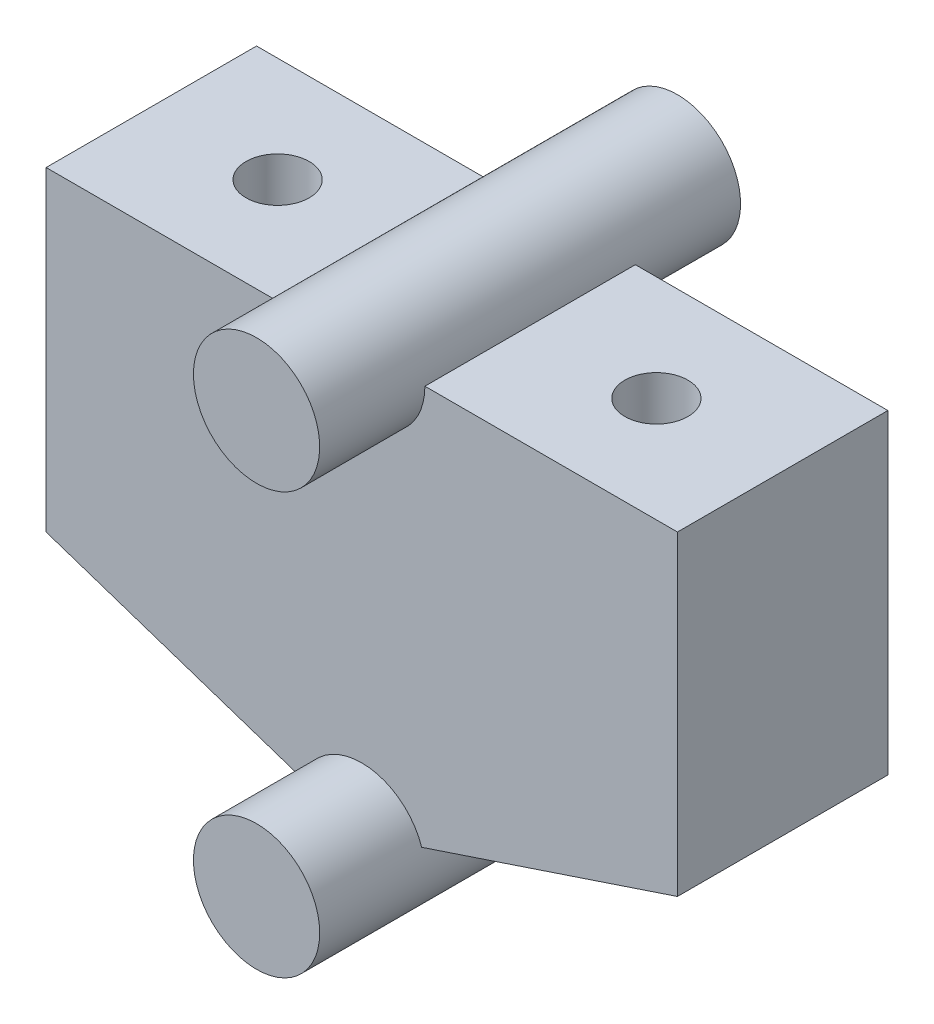
ISO-10303-21;
HEADER;
FILE_DESCRIPTION(('STEP AP214'),'2;1');
FILE_NAME('part.step','',(''),(''),'','','');
FILE_SCHEMA(('AUTOMOTIVE_DESIGN { 1 0 10303 214 1 1 1 1 }'));
ENDSEC;
DATA;
#1=APPLICATION_CONTEXT('core data for automotive mechanical design processes');
#2=APPLICATION_PROTOCOL_DEFINITION('international standard','automotive_design',2000,#1);
#3=PRODUCT_CONTEXT('',#1,'mechanical');
#4=PRODUCT('Part','Part','',(#3));
#5=PRODUCT_RELATED_PRODUCT_CATEGORY('part','',(#4));
#6=PRODUCT_DEFINITION_FORMATION('','',#4);
#7=PRODUCT_DEFINITION_CONTEXT('part definition',#1,'design');
#8=PRODUCT_DEFINITION('design','',#6,#7);
#9=PRODUCT_DEFINITION_SHAPE('','',#8);
#10=(LENGTH_UNIT() NAMED_UNIT(*) SI_UNIT(.MILLI.,.METRE.));
#11=(NAMED_UNIT(*) PLANE_ANGLE_UNIT() SI_UNIT($,.RADIAN.));
#12=(NAMED_UNIT(*) SI_UNIT($,.STERADIAN.) SOLID_ANGLE_UNIT());
#13=UNCERTAINTY_MEASURE_WITH_UNIT(LENGTH_MEASURE(1.E-05),#10,'distance_accuracy_value','');
#14=(GEOMETRIC_REPRESENTATION_CONTEXT(3) GLOBAL_UNCERTAINTY_ASSIGNED_CONTEXT((#13)) GLOBAL_UNIT_ASSIGNED_CONTEXT((#10,
#11,#12)) REPRESENTATION_CONTEXT('',''));
#15=CARTESIAN_POINT('',(0.,0.,0.));
#16=DIRECTION('',(0.,0.,1.));
#17=DIRECTION('',(1.,0.,0.));
#18=AXIS2_PLACEMENT_3D('',#15,#16,#17);
#19=CARTESIAN_POINT('',(0.,7.5,10.));
#20=DIRECTION('',(0.,1.,0.));
#21=DIRECTION('',(0.,0.,1.));
#22=AXIS2_PLACEMENT_3D('',#19,#20,#21);
#23=PLANE('',#22);
#24=DIRECTION('',(0.,0.,-1.));
#25=VECTOR('',#24,1.);
#26=CARTESIAN_POINT('',(3.,7.5,15.));
#27=LINE('',#26,#25);
#28=CARTESIAN_POINT('',(3.,7.5,10.));
#29=VERTEX_POINT('',#28);
#30=CARTESIAN_POINT('',(3.,7.5,0.));
#31=VERTEX_POINT('',#30);
#32=EDGE_CURVE('E52',#29,#31,#27,.T.);
#33=ORIENTED_EDGE('',*,*,#32,.F.);
#34=DIRECTION('',(1.,0.,0.));
#35=VECTOR('',#34,1.);
#36=CARTESIAN_POINT('',(0.,7.5,10.));
#37=LINE('',#36,#35);
#38=CARTESIAN_POINT('',(15.,7.5,10.));
#39=VERTEX_POINT('',#38);
#40=EDGE_CURVE('E184',#29,#39,#37,.T.);
#41=ORIENTED_EDGE('',*,*,#40,.T.);
#42=DIRECTION('',(0.,0.,-1.));
#43=VECTOR('',#42,1.);
#44=CARTESIAN_POINT('',(15.,7.5,10.));
#45=LINE('',#44,#43);
#46=CARTESIAN_POINT('',(15.,7.5,0.));
#47=VERTEX_POINT('',#46);
#48=EDGE_CURVE('E147',#39,#47,#45,.T.);
#49=ORIENTED_EDGE('',*,*,#48,.T.);
#50=DIRECTION('',(1.,0.,0.));
#51=VECTOR('',#50,1.);
#52=CARTESIAN_POINT('',(0.,7.5,0.));
#53=LINE('',#52,#51);
#54=EDGE_CURVE('E130',#31,#47,#53,.T.);
#55=ORIENTED_EDGE('',*,*,#54,.F.);
#56=EDGE_LOOP('',(#33,#41,#49,#55));
#57=FACE_BOUND('',#56,.T.);
#58=CARTESIAN_POINT('',(9.,7.5,5.));
#59=DIRECTION('',(0.,1.,0.));
#60=DIRECTION('',(0.,0.,-1.));
#61=AXIS2_PLACEMENT_3D('',#58,#59,#60);
#62=CIRCLE('',#61,1.5);
#63=CARTESIAN_POINT('',(9.,7.5,3.5));
#64=VERTEX_POINT('',#63);
#65=EDGE_CURVE('E163',#64,#64,#62,.T.);
#66=ORIENTED_EDGE('',*,*,#65,.F.);
#67=EDGE_LOOP('',(#66));
#68=FACE_BOUND('',#67,.T.);
#69=ADVANCED_FACE('F37',(#57,#68),#23,.T.);
#70=CARTESIAN_POINT('',(3.75,-11.25,10.));
#71=DIRECTION('',(-0.316227766016838,0.948683298050514,0.));
#72=DIRECTION('',(-0.948683298050514,-0.316227766016838,0.));
#73=AXIS2_PLACEMENT_3D('',#70,#71,#72);
#74=PLANE('',#73);
#75=CARTESIAN_POINT('',(9.,-9.49999999999999,5.));
#76=DIRECTION('',(-0.316227766016838,0.948683298050514,0.));
#77=DIRECTION('',(0.948683298050514,0.316227766016838,0.));
#78=AXIS2_PLACEMENT_3D('',#75,#76,#77);
#79=ELLIPSE('',#78,1.58113883008419,1.5);
#80=CARTESIAN_POINT('',(10.5,-8.99999999999999,5.));
#81=VERTEX_POINT('',#80);
#82=EDGE_CURVE('E155',#81,#81,#79,.T.);
#83=ORIENTED_EDGE('',*,*,#82,.T.);
#84=EDGE_LOOP('',(#83));
#85=FACE_BOUND('',#84,.T.);
#86=DIRECTION('',(0.948683298050514,0.316227766016838,0.));
#87=VECTOR('',#86,1.);
#88=CARTESIAN_POINT('',(3.75,-11.25,0.));
#89=LINE('',#88,#87);
#90=CARTESIAN_POINT('',(2.84604989415154,-11.5513167019495,0.));
#91=VERTEX_POINT('',#90);
#92=CARTESIAN_POINT('',(15.,-7.5,0.));
#93=VERTEX_POINT('',#92);
#94=EDGE_CURVE('E189',#91,#93,#89,.T.);
#95=ORIENTED_EDGE('',*,*,#94,.T.);
#96=DIRECTION('',(0.,0.,-1.));
#97=VECTOR('',#96,1.);
#98=CARTESIAN_POINT('',(15.,-7.5,10.));
#99=LINE('',#98,#97);
#100=CARTESIAN_POINT('',(15.,-7.5,10.));
#101=VERTEX_POINT('',#100);
#102=EDGE_CURVE('E150',#101,#93,#99,.T.);
#103=ORIENTED_EDGE('',*,*,#102,.F.);
#104=DIRECTION('',(0.948683298050514,0.316227766016838,0.));
#105=VECTOR('',#104,1.);
#106=CARTESIAN_POINT('',(3.75,-11.25,10.));
#107=LINE('',#106,#105);
#108=CARTESIAN_POINT('',(2.84604989415154,-11.5513167019495,10.));
#109=VERTEX_POINT('',#108);
#110=EDGE_CURVE('E93',#109,#101,#107,.T.);
#111=ORIENTED_EDGE('',*,*,#110,.F.);
#112=DIRECTION('',(0.,0.,-1.));
#113=VECTOR('',#112,1.);
#114=CARTESIAN_POINT('',(2.84604989415154,-11.5513167019495,10.));
#115=LINE('',#114,#113);
#116=EDGE_CURVE('E45',#109,#91,#115,.T.);
#117=ORIENTED_EDGE('',*,*,#116,.T.);
#118=EDGE_LOOP('',(#95,#103,#111,#117));
#119=FACE_BOUND('',#118,.T.);
#120=ADVANCED_FACE('F39',(#85,#119),#74,.F.);
#121=CARTESIAN_POINT('',(15.,0.,10.));
#122=DIRECTION('',(1.,0.,0.));
#123=DIRECTION('',(0.,1.,0.));
#124=AXIS2_PLACEMENT_3D('',#121,#122,#123);
#125=PLANE('',#124);
#126=DIRECTION('',(0.,-1.,0.));
#127=VECTOR('',#126,1.);
#128=CARTESIAN_POINT('',(15.,0.,0.));
#129=LINE('',#128,#127);
#130=EDGE_CURVE('E134',#47,#93,#129,.T.);
#131=ORIENTED_EDGE('',*,*,#130,.F.);
#132=ORIENTED_EDGE('',*,*,#48,.F.);
#133=DIRECTION('',(0.,-1.,0.));
#134=VECTOR('',#133,1.);
#135=CARTESIAN_POINT('',(15.,0.,10.));
#136=LINE('',#135,#134);
#137=EDGE_CURVE('E181',#39,#101,#136,.T.);
#138=ORIENTED_EDGE('',*,*,#137,.T.);
#139=ORIENTED_EDGE('',*,*,#102,.T.);
#140=EDGE_LOOP('',(#131,#132,#138,#139));
#141=FACE_BOUND('',#140,.T.);
#142=ADVANCED_FACE('F197',(#141),#125,.T.);
#143=DIRECTION('',(0.,0.,-1.));
#144=VECTOR('',#143,1.);
#145=CARTESIAN_POINT('',(-3.,7.5,15.));
#146=LINE('',#145,#144);
#147=CARTESIAN_POINT('',(-3.,7.5,0.));
#148=VERTEX_POINT('',#147);
#149=CARTESIAN_POINT('',(-3.,7.5,10.));
#150=VERTEX_POINT('',#149);
#151=EDGE_CURVE('E112',#148,#150,#146,.F.);
#152=ORIENTED_EDGE('',*,*,#151,.F.);
#153=CARTESIAN_POINT('',(-15.,7.5,0.));
#154=VERTEX_POINT('',#153);
#155=EDGE_CURVE('E122',#154,#148,#53,.T.);
#156=ORIENTED_EDGE('',*,*,#155,.F.);
#157=DIRECTION('',(0.,0.,-1.));
#158=VECTOR('',#157,1.);
#159=CARTESIAN_POINT('',(-15.,7.5,10.));
#160=LINE('',#159,#158);
#161=CARTESIAN_POINT('',(-15.,7.5,10.));
#162=VERTEX_POINT('',#161);
#163=EDGE_CURVE('E145',#162,#154,#160,.T.);
#164=ORIENTED_EDGE('',*,*,#163,.F.);
#165=EDGE_CURVE('E123',#162,#150,#37,.T.);
#166=ORIENTED_EDGE('',*,*,#165,.T.);
#167=EDGE_LOOP('',(#152,#156,#164,#166));
#168=FACE_BOUND('',#167,.T.);
#169=CARTESIAN_POINT('',(-9.,7.5,5.));
#170=DIRECTION('',(0.,1.,0.));
#171=DIRECTION('',(0.,0.,1.));
#172=AXIS2_PLACEMENT_3D('',#169,#170,#171);
#173=CIRCLE('',#172,1.5);
#174=CARTESIAN_POINT('',(-9.,7.5,6.5));
#175=VERTEX_POINT('',#174);
#176=EDGE_CURVE('E156',#175,#175,#173,.T.);
#177=ORIENTED_EDGE('',*,*,#176,.F.);
#178=EDGE_LOOP('',(#177));
#179=FACE_BOUND('',#178,.T.);
#180=ADVANCED_FACE('F120',(#168,#179),#23,.T.);
#181=CARTESIAN_POINT('',(-15.,0.,10.));
#182=DIRECTION('',(1.,0.,0.));
#183=DIRECTION('',(0.,1.,0.));
#184=AXIS2_PLACEMENT_3D('',#181,#182,#183);
#185=PLANE('',#184);
#186=DIRECTION('',(0.,-1.,0.));
#187=VECTOR('',#186,1.);
#188=CARTESIAN_POINT('',(-15.,0.,0.));
#189=LINE('',#188,#187);
#190=CARTESIAN_POINT('',(-15.,-7.5,0.));
#191=VERTEX_POINT('',#190);
#192=EDGE_CURVE('E129',#154,#191,#189,.T.);
#193=ORIENTED_EDGE('',*,*,#192,.T.);
#194=DIRECTION('',(0.,0.,-1.));
#195=VECTOR('',#194,1.);
#196=CARTESIAN_POINT('',(-15.,-7.5,10.));
#197=LINE('',#196,#195);
#198=CARTESIAN_POINT('',(-15.,-7.5,10.));
#199=VERTEX_POINT('',#198);
#200=EDGE_CURVE('E141',#199,#191,#197,.T.);
#201=ORIENTED_EDGE('',*,*,#200,.F.);
#202=DIRECTION('',(0.,-1.,0.));
#203=VECTOR('',#202,1.);
#204=CARTESIAN_POINT('',(-15.,0.,10.));
#205=LINE('',#204,#203);
#206=EDGE_CURVE('E60',#162,#199,#205,.T.);
#207=ORIENTED_EDGE('',*,*,#206,.F.);
#208=ORIENTED_EDGE('',*,*,#163,.T.);
#209=EDGE_LOOP('',(#193,#201,#207,#208));
#210=FACE_BOUND('',#209,.T.);
#211=ADVANCED_FACE('F205',(#210),#185,.F.);
#212=CARTESIAN_POINT('',(-3.75,-11.25,10.));
#213=DIRECTION('',(0.316227766016838,0.948683298050514,0.));
#214=DIRECTION('',(-0.948683298050514,0.316227766016838,0.));
#215=AXIS2_PLACEMENT_3D('',#212,#213,#214);
#216=PLANE('',#215);
#217=CARTESIAN_POINT('',(-9.,-9.5,5.));
#218=DIRECTION('',(0.316227766016838,0.948683298050514,0.));
#219=DIRECTION('',(-0.948683298050514,0.316227766016838,0.));
#220=AXIS2_PLACEMENT_3D('',#217,#218,#219);
#221=ELLIPSE('',#220,1.58113883008419,1.5);
#222=CARTESIAN_POINT('',(-10.5,-9.,5.));
#223=VERTEX_POINT('',#222);
#224=EDGE_CURVE('E153',#223,#223,#221,.T.);
#225=ORIENTED_EDGE('',*,*,#224,.T.);
#226=EDGE_LOOP('',(#225));
#227=FACE_BOUND('',#226,.T.);
#228=DIRECTION('',(0.948683298050514,-0.316227766016838,0.));
#229=VECTOR('',#228,1.);
#230=CARTESIAN_POINT('',(-3.75,-11.25,0.));
#231=LINE('',#230,#229);
#232=CARTESIAN_POINT('',(-2.84604989415154,-11.5513167019495,0.));
#233=VERTEX_POINT('',#232);
#234=EDGE_CURVE('E132',#191,#233,#231,.T.);
#235=ORIENTED_EDGE('',*,*,#234,.T.);
#236=DIRECTION('',(0.,0.,-1.));
#237=VECTOR('',#236,1.);
#238=CARTESIAN_POINT('',(-2.84604989415154,-11.5513167019495,10.));
#239=LINE('',#238,#237);
#240=CARTESIAN_POINT('',(-2.84604989415154,-11.5513167019495,10.));
#241=VERTEX_POINT('',#240);
#242=EDGE_CURVE('E86',#241,#233,#239,.T.);
#243=ORIENTED_EDGE('',*,*,#242,.F.);
#244=DIRECTION('',(0.948683298050514,-0.316227766016838,0.));
#245=VECTOR('',#244,1.);
#246=CARTESIAN_POINT('',(-3.75,-11.25,10.));
#247=LINE('',#246,#245);
#248=EDGE_CURVE('E142',#199,#241,#247,.T.);
#249=ORIENTED_EDGE('',*,*,#248,.F.);
#250=ORIENTED_EDGE('',*,*,#200,.T.);
#251=EDGE_LOOP('',(#235,#243,#249,#250));
#252=FACE_BOUND('',#251,.T.);
#253=ADVANCED_FACE('F203',(#227,#252),#216,.F.);
#254=CARTESIAN_POINT('',(0.,0.,10.));
#255=DIRECTION('',(0.,0.,1.));
#256=DIRECTION('',(1.,0.,0.));
#257=AXIS2_PLACEMENT_3D('',#254,#255,#256);
#258=PLANE('',#257);
#259=CARTESIAN_POINT('',(0.,7.5,10.));
#260=DIRECTION('',(0.,0.,1.));
#261=DIRECTION('',(1.,0.,0.));
#262=AXIS2_PLACEMENT_3D('',#259,#260,#261);
#263=CIRCLE('',#262,3.);
#264=EDGE_CURVE('E168',#150,#29,#263,.T.);
#265=ORIENTED_EDGE('',*,*,#264,.F.);
#266=ORIENTED_EDGE('',*,*,#165,.F.);
#267=ORIENTED_EDGE('',*,*,#206,.T.);
#268=ORIENTED_EDGE('',*,*,#248,.T.);
#269=CARTESIAN_POINT('',(0.,-12.5,10.));
#270=DIRECTION('',(0.,0.,1.));
#271=DIRECTION('',(1.,0.,0.));
#272=AXIS2_PLACEMENT_3D('',#269,#270,#271);
#273=CIRCLE('',#272,3.);
#274=EDGE_CURVE('E139',#109,#241,#273,.T.);
#275=ORIENTED_EDGE('',*,*,#274,.F.);
#276=ORIENTED_EDGE('',*,*,#110,.T.);
#277=ORIENTED_EDGE('',*,*,#137,.F.);
#278=ORIENTED_EDGE('',*,*,#40,.F.);
#279=EDGE_LOOP('',(#265,#266,#267,#268,#275,#276,#277,#278));
#280=FACE_BOUND('',#279,.T.);
#281=ADVANCED_FACE('F198',(#280),#258,.T.);
#282=CARTESIAN_POINT('',(0.,0.,0.));
#283=DIRECTION('',(0.,0.,1.));
#284=DIRECTION('',(1.,0.,0.));
#285=AXIS2_PLACEMENT_3D('',#282,#283,#284);
#286=PLANE('',#285);
#287=ORIENTED_EDGE('',*,*,#155,.T.);
#288=CARTESIAN_POINT('',(0.,7.5,0.));
#289=DIRECTION('',(0.,0.,1.));
#290=DIRECTION('',(1.,0.,0.));
#291=AXIS2_PLACEMENT_3D('',#288,#289,#290);
#292=CIRCLE('',#291,3.);
#293=EDGE_CURVE('E11',#148,#31,#292,.T.);
#294=ORIENTED_EDGE('',*,*,#293,.T.);
#295=ORIENTED_EDGE('',*,*,#54,.T.);
#296=ORIENTED_EDGE('',*,*,#130,.T.);
#297=ORIENTED_EDGE('',*,*,#94,.F.);
#298=CARTESIAN_POINT('',(0.,-12.5,0.));
#299=DIRECTION('',(0.,0.,1.));
#300=DIRECTION('',(1.,0.,0.));
#301=AXIS2_PLACEMENT_3D('',#298,#299,#300);
#302=CIRCLE('',#301,3.);
#303=EDGE_CURVE('E178',#91,#233,#302,.T.);
#304=ORIENTED_EDGE('',*,*,#303,.T.);
#305=ORIENTED_EDGE('',*,*,#234,.F.);
#306=ORIENTED_EDGE('',*,*,#192,.F.);
#307=EDGE_LOOP('',(#287,#294,#295,#296,#297,#304,#305,#306));
#308=FACE_BOUND('',#307,.T.);
#309=ADVANCED_FACE('F127',(#308),#286,.F.);
#310=CARTESIAN_POINT('',(0.,-12.5,-5.));
#311=DIRECTION('',(0.,0.,1.));
#312=DIRECTION('',(1.,0.,0.));
#313=AXIS2_PLACEMENT_3D('',#310,#311,#312);
#314=CYLINDRICAL_SURFACE('',#313,3.);
#315=ORIENTED_EDGE('',*,*,#116,.F.);
#316=ORIENTED_EDGE('',*,*,#274,.T.);
#317=ORIENTED_EDGE('',*,*,#242,.T.);
#318=ORIENTED_EDGE('',*,*,#303,.F.);
#319=EDGE_LOOP('',(#315,#316,#317,#318));
#320=FACE_BOUND('',#319,.T.);
#321=CARTESIAN_POINT('',(0.,-12.5,-5.));
#322=DIRECTION('',(0.,0.,1.));
#323=DIRECTION('',(1.,0.,0.));
#324=AXIS2_PLACEMENT_3D('',#321,#322,#323);
#325=CIRCLE('',#324,3.);
#326=CARTESIAN_POINT('',(3.,-12.5,-5.));
#327=VERTEX_POINT('',#326);
#328=EDGE_CURVE('E175',#327,#327,#325,.T.);
#329=ORIENTED_EDGE('',*,*,#328,.T.);
#330=EDGE_LOOP('',(#329));
#331=FACE_BOUND('',#330,.T.);
#332=CARTESIAN_POINT('',(0.,-12.5,15.));
#333=DIRECTION('',(0.,0.,1.));
#334=DIRECTION('',(1.,0.,0.));
#335=AXIS2_PLACEMENT_3D('',#332,#333,#334);
#336=CIRCLE('',#335,3.);
#337=CARTESIAN_POINT('',(3.,-12.5,15.));
#338=VERTEX_POINT('',#337);
#339=EDGE_CURVE('E160',#338,#338,#336,.T.);
#340=ORIENTED_EDGE('',*,*,#339,.F.);
#341=EDGE_LOOP('',(#340));
#342=FACE_BOUND('',#341,.T.);
#343=ADVANCED_FACE('F200',(#320,#331,#342),#314,.T.);
#344=CARTESIAN_POINT('',(0.,0.,-5.));
#345=DIRECTION('',(0.,0.,1.));
#346=DIRECTION('',(1.,0.,0.));
#347=AXIS2_PLACEMENT_3D('',#344,#345,#346);
#348=PLANE('',#347);
#349=ORIENTED_EDGE('',*,*,#328,.F.);
#350=EDGE_LOOP('',(#349));
#351=FACE_BOUND('',#350,.T.);
#352=ADVANCED_FACE('F330',(#351),#348,.F.);
#353=CARTESIAN_POINT('',(0.,0.,15.));
#354=DIRECTION('',(0.,0.,1.));
#355=DIRECTION('',(1.,0.,0.));
#356=AXIS2_PLACEMENT_3D('',#353,#354,#355);
#357=PLANE('',#356);
#358=ORIENTED_EDGE('',*,*,#339,.T.);
#359=EDGE_LOOP('',(#358));
#360=FACE_BOUND('',#359,.T.);
#361=ADVANCED_FACE('F257',(#360),#357,.T.);
#362=CARTESIAN_POINT('',(-9.,-15.5,5.));
#363=DIRECTION('',(0.,1.,0.));
#364=DIRECTION('',(0.,0.,1.));
#365=AXIS2_PLACEMENT_3D('',#362,#363,#364);
#366=CYLINDRICAL_SURFACE('',#365,1.5);
#367=ORIENTED_EDGE('',*,*,#176,.T.);
#368=EDGE_LOOP('',(#367));
#369=FACE_BOUND('',#368,.T.);
#370=ORIENTED_EDGE('',*,*,#224,.F.);
#371=EDGE_LOOP('',(#370));
#372=FACE_BOUND('',#371,.T.);
#373=ADVANCED_FACE('F226',(#369,#372),#366,.F.);
#374=CARTESIAN_POINT('',(9.,-15.5,5.));
#375=DIRECTION('',(0.,1.,0.));
#376=DIRECTION('',(0.,0.,1.));
#377=AXIS2_PLACEMENT_3D('',#374,#375,#376);
#378=CYLINDRICAL_SURFACE('',#377,1.5);
#379=ORIENTED_EDGE('',*,*,#65,.T.);
#380=EDGE_LOOP('',(#379));
#381=FACE_BOUND('',#380,.T.);
#382=ORIENTED_EDGE('',*,*,#82,.F.);
#383=EDGE_LOOP('',(#382));
#384=FACE_BOUND('',#383,.T.);
#385=ADVANCED_FACE('F218',(#381,#384),#378,.F.);
#386=CARTESIAN_POINT('',(0.,7.5,15.));
#387=DIRECTION('',(0.,0.,-1.));
#388=DIRECTION('',(-1.,0.,0.));
#389=AXIS2_PLACEMENT_3D('',#386,#387,#388);
#390=CYLINDRICAL_SURFACE('',#389,3.);
#391=ORIENTED_EDGE('',*,*,#151,.T.);
#392=ORIENTED_EDGE('',*,*,#264,.T.);
#393=ORIENTED_EDGE('',*,*,#32,.T.);
#394=ORIENTED_EDGE('',*,*,#293,.F.);
#395=EDGE_LOOP('',(#391,#392,#393,#394));
#396=FACE_BOUND('',#395,.T.);
#397=CARTESIAN_POINT('',(0.,7.5,15.));
#398=DIRECTION('',(0.,0.,-1.));
#399=DIRECTION('',(-1.,0.,0.));
#400=AXIS2_PLACEMENT_3D('',#397,#398,#399);
#401=CIRCLE('',#400,3.);
#402=CARTESIAN_POINT('',(-3.,7.5,15.));
#403=VERTEX_POINT('',#402);
#404=EDGE_CURVE('E124',#403,#403,#401,.T.);
#405=ORIENTED_EDGE('',*,*,#404,.T.);
#406=EDGE_LOOP('',(#405));
#407=FACE_BOUND('',#406,.T.);
#408=CARTESIAN_POINT('',(0.,7.5,-5.));
#409=DIRECTION('',(0.,0.,-1.));
#410=DIRECTION('',(-1.,0.,0.));
#411=AXIS2_PLACEMENT_3D('',#408,#409,#410);
#412=CIRCLE('',#411,3.);
#413=CARTESIAN_POINT('',(-3.,7.5,-5.));
#414=VERTEX_POINT('',#413);
#415=EDGE_CURVE('E210',#414,#414,#412,.T.);
#416=ORIENTED_EDGE('',*,*,#415,.F.);
#417=EDGE_LOOP('',(#416));
#418=FACE_BOUND('',#417,.T.);
#419=ADVANCED_FACE('F110',(#396,#407,#418),#390,.T.);
#420=CARTESIAN_POINT('',(0.,7.5,15.));
#421=DIRECTION('',(0.,0.,-1.));
#422=DIRECTION('',(-1.,0.,0.));
#423=AXIS2_PLACEMENT_3D('',#420,#421,#422);
#424=PLANE('',#423);
#425=ORIENTED_EDGE('',*,*,#404,.F.);
#426=EDGE_LOOP('',(#425));
#427=FACE_BOUND('',#426,.T.);
#428=ADVANCED_FACE('F217',(#427),#424,.F.);
#429=CARTESIAN_POINT('',(0.,7.5,-5.));
#430=DIRECTION('',(0.,0.,-1.));
#431=DIRECTION('',(-1.,0.,0.));
#432=AXIS2_PLACEMENT_3D('',#429,#430,#431);
#433=PLANE('',#432);
#434=ORIENTED_EDGE('',*,*,#415,.T.);
#435=EDGE_LOOP('',(#434));
#436=FACE_BOUND('',#435,.T.);
#437=ADVANCED_FACE('F214',(#436),#433,.T.);
#438=CLOSED_SHELL('',(#69,#120,#142,#180,#211,#253,#281,#309,#343,#352,#361,#373,#385,#419,#428,#437));
#439=MANIFOLD_SOLID_BREP('B2',#438);
#440=ADVANCED_BREP_SHAPE_REPRESENTATION('',(#18,#439),#14);
#441=SHAPE_DEFINITION_REPRESENTATION(#9,#440);
ENDSEC;
END-ISO-10303-21;
